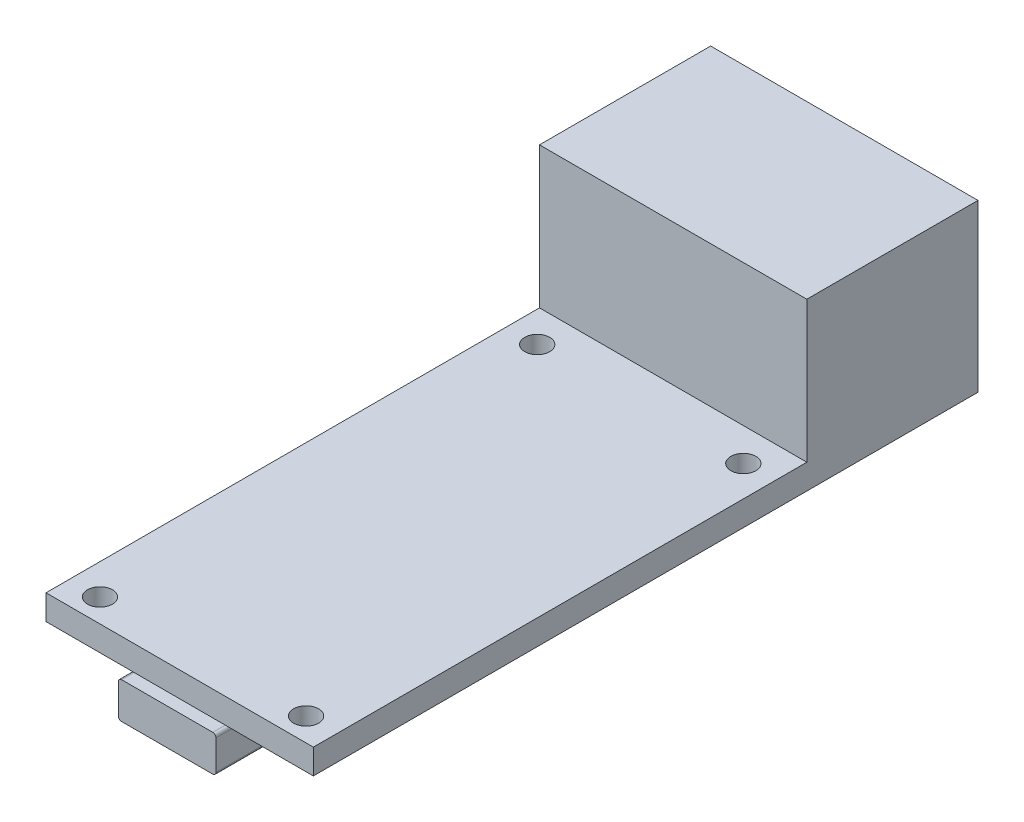
ISO-10303-21;
HEADER;
FILE_DESCRIPTION(('STEP AP214'),'2;1');
FILE_NAME('part.step','',(''),(''),'','','');
FILE_SCHEMA(('AUTOMOTIVE_DESIGN { 1 0 10303 214 1 1 1 1 }'));
ENDSEC;
DATA;
#1=APPLICATION_CONTEXT('core data for automotive mechanical design processes');
#2=APPLICATION_PROTOCOL_DEFINITION('international standard','automotive_design',2000,#1);
#3=PRODUCT_CONTEXT('',#1,'mechanical');
#4=PRODUCT('Part','Part','',(#3));
#5=PRODUCT_RELATED_PRODUCT_CATEGORY('part','',(#4));
#6=PRODUCT_DEFINITION_FORMATION('','',#4);
#7=PRODUCT_DEFINITION_CONTEXT('part definition',#1,'design');
#8=PRODUCT_DEFINITION('design','',#6,#7);
#9=PRODUCT_DEFINITION_SHAPE('','',#8);
#10=(LENGTH_UNIT() NAMED_UNIT(*) SI_UNIT(.MILLI.,.METRE.));
#11=(NAMED_UNIT(*) PLANE_ANGLE_UNIT() SI_UNIT($,.RADIAN.));
#12=(NAMED_UNIT(*) SI_UNIT($,.STERADIAN.) SOLID_ANGLE_UNIT());
#13=UNCERTAINTY_MEASURE_WITH_UNIT(LENGTH_MEASURE(1.E-05),#10,'distance_accuracy_value','');
#14=(GEOMETRIC_REPRESENTATION_CONTEXT(3) GLOBAL_UNCERTAINTY_ASSIGNED_CONTEXT((#13)) GLOBAL_UNIT_ASSIGNED_CONTEXT((#10,
#11,#12)) REPRESENTATION_CONTEXT('',''));
#15=CARTESIAN_POINT('',(0.,0.,0.));
#16=DIRECTION('',(0.,0.,1.));
#17=DIRECTION('',(1.,0.,0.));
#18=AXIS2_PLACEMENT_3D('',#15,#16,#17);
#19=CARTESIAN_POINT('',(0.,2.,0.));
#20=DIRECTION('',(0.,0.,-1.));
#21=DIRECTION('',(-1.,0.,0.));
#22=AXIS2_PLACEMENT_3D('',#19,#20,#21);
#23=PLANE('',#22);
#24=DIRECTION('',(-1.,0.,0.));
#25=VECTOR('',#24,1.);
#26=CARTESIAN_POINT('',(7.05,0.,0.));
#27=LINE('',#26,#25);
#28=CARTESIAN_POINT('',(14.35,0.,0.));
#29=VERTEX_POINT('',#28);
#30=CARTESIAN_POINT('',(7.05,0.,0.));
#31=VERTEX_POINT('',#30);
#32=EDGE_CURVE('E53',#29,#31,#27,.T.);
#33=ORIENTED_EDGE('',*,*,#32,.F.);
#34=DIRECTION('',(1.,0.,0.));
#35=VECTOR('',#34,1.);
#36=CARTESIAN_POINT('',(0.,0.,0.));
#37=LINE('',#36,#35);
#38=CARTESIAN_POINT('',(21.4,0.,0.));
#39=VERTEX_POINT('',#38);
#40=EDGE_CURVE('E273',#29,#39,#37,.T.);
#41=ORIENTED_EDGE('',*,*,#40,.T.);
#42=DIRECTION('',(0.,-1.,0.));
#43=VECTOR('',#42,1.);
#44=CARTESIAN_POINT('',(21.4,2.,0.));
#45=LINE('',#44,#43);
#46=CARTESIAN_POINT('',(21.4,2.,0.));
#47=VERTEX_POINT('',#46);
#48=EDGE_CURVE('E46',#47,#39,#45,.T.);
#49=ORIENTED_EDGE('',*,*,#48,.F.);
#50=DIRECTION('',(1.,0.,0.));
#51=VECTOR('',#50,1.);
#52=CARTESIAN_POINT('',(0.,2.,0.));
#53=LINE('',#52,#51);
#54=CARTESIAN_POINT('',(0.,2.,0.));
#55=VERTEX_POINT('',#54);
#56=EDGE_CURVE('E265',#55,#47,#53,.T.);
#57=ORIENTED_EDGE('',*,*,#56,.F.);
#58=DIRECTION('',(0.,-1.,0.));
#59=VECTOR('',#58,1.);
#60=CARTESIAN_POINT('',(0.,2.,0.));
#61=LINE('',#60,#59);
#62=CARTESIAN_POINT('',(0.,0.,0.));
#63=VERTEX_POINT('',#62);
#64=EDGE_CURVE('E11',#55,#63,#61,.T.);
#65=ORIENTED_EDGE('',*,*,#64,.T.);
#66=EDGE_CURVE('E274',#63,#31,#37,.T.);
#67=ORIENTED_EDGE('',*,*,#66,.T.);
#68=EDGE_LOOP('',(#33,#41,#49,#57,#65,#67));
#69=FACE_BOUND('',#68,.T.);
#70=ADVANCED_FACE('F38',(#69),#23,.F.);
#71=CARTESIAN_POINT('',(0.,2.,0.));
#72=DIRECTION('',(0.,-1.,0.));
#73=DIRECTION('',(0.,0.,-1.));
#74=AXIS2_PLACEMENT_3D('',#71,#72,#73);
#75=PLANE('',#74);
#76=CARTESIAN_POINT('',(2.44999999999999,2.,-36.869115366261));
#77=DIRECTION('',(0.,1.,0.));
#78=DIRECTION('',(0.,0.,1.));
#79=AXIS2_PLACEMENT_3D('',#76,#77,#78);
#80=CIRCLE('',#79,0.999999999999991);
#81=CARTESIAN_POINT('',(2.44999999999999,2.,-35.869115366261));
#82=VERTEX_POINT('',#81);
#83=EDGE_CURVE('E200',#82,#82,#80,.T.);
#84=ORIENTED_EDGE('',*,*,#83,.F.);
#85=EDGE_LOOP('',(#84));
#86=FACE_BOUND('',#85,.T.);
#87=CARTESIAN_POINT('',(18.95,2.,-36.869115366261));
#88=DIRECTION('',(0.,1.,0.));
#89=DIRECTION('',(0.,0.,1.));
#90=AXIS2_PLACEMENT_3D('',#87,#88,#89);
#91=CIRCLE('',#90,0.99999999999999);
#92=CARTESIAN_POINT('',(18.95,2.,-35.869115366261));
#93=VERTEX_POINT('',#92);
#94=EDGE_CURVE('E220',#93,#93,#91,.T.);
#95=ORIENTED_EDGE('',*,*,#94,.F.);
#96=EDGE_LOOP('',(#95));
#97=FACE_BOUND('',#96,.T.);
#98=CARTESIAN_POINT('',(18.95,2.,-1.86911536626101));
#99=DIRECTION('',(0.,1.,0.));
#100=DIRECTION('',(0.,0.,1.));
#101=AXIS2_PLACEMENT_3D('',#98,#99,#100);
#102=CIRCLE('',#101,0.99999999999999);
#103=CARTESIAN_POINT('',(18.95,2.,-0.869115366261017));
#104=VERTEX_POINT('',#103);
#105=EDGE_CURVE('E226',#104,#104,#102,.T.);
#106=ORIENTED_EDGE('',*,*,#105,.F.);
#107=EDGE_LOOP('',(#106));
#108=FACE_BOUND('',#107,.T.);
#109=CARTESIAN_POINT('',(2.44999999999999,2.,-1.86911536626101));
#110=DIRECTION('',(0.,1.,0.));
#111=DIRECTION('',(0.,0.,1.));
#112=AXIS2_PLACEMENT_3D('',#109,#110,#111);
#113=CIRCLE('',#112,0.999999999999991);
#114=CARTESIAN_POINT('',(2.44999999999999,2.,-0.869115366261016));
#115=VERTEX_POINT('',#114);
#116=EDGE_CURVE('E232',#115,#115,#113,.T.);
#117=ORIENTED_EDGE('',*,*,#116,.F.);
#118=EDGE_LOOP('',(#117));
#119=FACE_BOUND('',#118,.T.);
#120=DIRECTION('',(1.,0.,0.));
#121=VECTOR('',#120,1.);
#122=CARTESIAN_POINT('',(0.,2.,-39.5));
#123=LINE('',#122,#121);
#124=CARTESIAN_POINT('',(0.,2.,-39.5));
#125=VERTEX_POINT('',#124);
#126=CARTESIAN_POINT('',(21.4,2.,-39.5));
#127=VERTEX_POINT('',#126);
#128=EDGE_CURVE('E61',#125,#127,#123,.T.);
#129=ORIENTED_EDGE('',*,*,#128,.F.);
#130=DIRECTION('',(0.,0.,1.));
#131=VECTOR('',#130,1.);
#132=CARTESIAN_POINT('',(0.,2.,0.));
#133=LINE('',#132,#131);
#134=EDGE_CURVE('E263',#125,#55,#133,.T.);
#135=ORIENTED_EDGE('',*,*,#134,.T.);
#136=ORIENTED_EDGE('',*,*,#56,.T.);
#137=DIRECTION('',(0.,0.,-1.));
#138=VECTOR('',#137,1.);
#139=CARTESIAN_POINT('',(21.4,2.,0.));
#140=LINE('',#139,#138);
#141=EDGE_CURVE('E268',#47,#127,#140,.T.);
#142=ORIENTED_EDGE('',*,*,#141,.T.);
#143=EDGE_LOOP('',(#129,#135,#136,#142));
#144=FACE_BOUND('',#143,.T.);
#145=ADVANCED_FACE('F320',(#86,#97,#108,#119,#144),#75,.F.);
#146=CARTESIAN_POINT('',(0.,2.,0.));
#147=DIRECTION('',(1.,0.,0.));
#148=DIRECTION('',(0.,0.,-1.));
#149=AXIS2_PLACEMENT_3D('',#146,#147,#148);
#150=PLANE('',#149);
#151=DIRECTION('',(0.,0.,1.));
#152=VECTOR('',#151,1.);
#153=CARTESIAN_POINT('',(0.,0.,0.));
#154=LINE('',#153,#152);
#155=CARTESIAN_POINT('',(0.,0.,-53.2));
#156=VERTEX_POINT('',#155);
#157=EDGE_CURVE('E262',#156,#63,#154,.T.);
#158=ORIENTED_EDGE('',*,*,#157,.T.);
#159=ORIENTED_EDGE('',*,*,#64,.F.);
#160=ORIENTED_EDGE('',*,*,#134,.F.);
#161=DIRECTION('',(0.,-1.,0.));
#162=VECTOR('',#161,1.);
#163=CARTESIAN_POINT('',(0.,13.3,-39.5));
#164=LINE('',#163,#162);
#165=CARTESIAN_POINT('',(0.,13.3,-39.5));
#166=VERTEX_POINT('',#165);
#167=EDGE_CURVE('E259',#166,#125,#164,.T.);
#168=ORIENTED_EDGE('',*,*,#167,.F.);
#169=DIRECTION('',(0.,0.,1.));
#170=VECTOR('',#169,1.);
#171=CARTESIAN_POINT('',(0.,13.3,-53.2));
#172=LINE('',#171,#170);
#173=CARTESIAN_POINT('',(0.,13.3,-53.2));
#174=VERTEX_POINT('',#173);
#175=EDGE_CURVE('E244',#174,#166,#172,.T.);
#176=ORIENTED_EDGE('',*,*,#175,.F.);
#177=DIRECTION('',(0.,-1.,0.));
#178=VECTOR('',#177,1.);
#179=CARTESIAN_POINT('',(0.,2.,-53.2));
#180=LINE('',#179,#178);
#181=EDGE_CURVE('E270',#174,#156,#180,.T.);
#182=ORIENTED_EDGE('',*,*,#181,.T.);
#183=EDGE_LOOP('',(#158,#159,#160,#168,#176,#182));
#184=FACE_BOUND('',#183,.T.);
#185=ADVANCED_FACE('F40',(#184),#150,.F.);
#186=CARTESIAN_POINT('',(21.4,2.,0.));
#187=DIRECTION('',(-1.,0.,0.));
#188=DIRECTION('',(0.,0.,1.));
#189=AXIS2_PLACEMENT_3D('',#186,#187,#188);
#190=PLANE('',#189);
#191=DIRECTION('',(0.,0.,-1.));
#192=VECTOR('',#191,1.);
#193=CARTESIAN_POINT('',(21.4,0.,0.));
#194=LINE('',#193,#192);
#195=CARTESIAN_POINT('',(21.4,0.,-53.2));
#196=VERTEX_POINT('',#195);
#197=EDGE_CURVE('E276',#39,#196,#194,.T.);
#198=ORIENTED_EDGE('',*,*,#197,.T.);
#199=DIRECTION('',(0.,-1.,0.));
#200=VECTOR('',#199,1.);
#201=CARTESIAN_POINT('',(21.4,2.,-53.2));
#202=LINE('',#201,#200);
#203=CARTESIAN_POINT('',(21.4,13.3,-53.2));
#204=VERTEX_POINT('',#203);
#205=EDGE_CURVE('E281',#204,#196,#202,.T.);
#206=ORIENTED_EDGE('',*,*,#205,.F.);
#207=DIRECTION('',(0.,0.,-1.));
#208=VECTOR('',#207,1.);
#209=CARTESIAN_POINT('',(21.4,13.3,-53.2));
#210=LINE('',#209,#208);
#211=CARTESIAN_POINT('',(21.4,13.3,-39.5));
#212=VERTEX_POINT('',#211);
#213=EDGE_CURVE('E249',#212,#204,#210,.T.);
#214=ORIENTED_EDGE('',*,*,#213,.F.);
#215=DIRECTION('',(0.,-1.,0.));
#216=VECTOR('',#215,1.);
#217=CARTESIAN_POINT('',(21.4,13.3,-39.5));
#218=LINE('',#217,#216);
#219=EDGE_CURVE('E255',#212,#127,#218,.T.);
#220=ORIENTED_EDGE('',*,*,#219,.T.);
#221=ORIENTED_EDGE('',*,*,#141,.F.);
#222=ORIENTED_EDGE('',*,*,#48,.T.);
#223=EDGE_LOOP('',(#198,#206,#214,#220,#221,#222));
#224=FACE_BOUND('',#223,.T.);
#225=ADVANCED_FACE('F288',(#224),#190,.F.);
#226=CARTESIAN_POINT('',(0.,2.,-53.2));
#227=DIRECTION('',(0.,0.,1.));
#228=DIRECTION('',(1.,0.,0.));
#229=AXIS2_PLACEMENT_3D('',#226,#227,#228);
#230=PLANE('',#229);
#231=CARTESIAN_POINT('',(10.7,7.65,-53.2));
#232=DIRECTION('',(0.,0.,-1.));
#233=DIRECTION('',(-1.,0.,0.));
#234=AXIS2_PLACEMENT_3D('',#231,#232,#233);
#235=CIRCLE('',#234,3.65);
#236=CARTESIAN_POINT('',(7.04999999999999,7.65,-53.2));
#237=VERTEX_POINT('',#236);
#238=EDGE_CURVE('E238',#237,#237,#235,.T.);
#239=ORIENTED_EDGE('',*,*,#238,.F.);
#240=EDGE_LOOP('',(#239));
#241=FACE_BOUND('',#240,.T.);
#242=DIRECTION('',(-1.,0.,0.));
#243=VECTOR('',#242,1.);
#244=CARTESIAN_POINT('',(0.,0.,-53.2));
#245=LINE('',#244,#243);
#246=EDGE_CURVE('E266',#196,#156,#245,.T.);
#247=ORIENTED_EDGE('',*,*,#246,.T.);
#248=ORIENTED_EDGE('',*,*,#181,.F.);
#249=DIRECTION('',(-1.,0.,0.));
#250=VECTOR('',#249,1.);
#251=CARTESIAN_POINT('',(0.,13.3,-53.2));
#252=LINE('',#251,#250);
#253=EDGE_CURVE('E252',#204,#174,#252,.T.);
#254=ORIENTED_EDGE('',*,*,#253,.F.);
#255=ORIENTED_EDGE('',*,*,#205,.T.);
#256=EDGE_LOOP('',(#247,#248,#254,#255));
#257=FACE_BOUND('',#256,.T.);
#258=ADVANCED_FACE('F296',(#241,#257),#230,.F.);
#259=CARTESIAN_POINT('',(0.,0.,0.));
#260=DIRECTION('',(0.,-1.,0.));
#261=DIRECTION('',(0.,0.,-1.));
#262=AXIS2_PLACEMENT_3D('',#259,#260,#261);
#263=PLANE('',#262);
#264=DIRECTION('',(0.,0.,1.));
#265=VECTOR('',#264,1.);
#266=CARTESIAN_POINT('',(14.35,0.,-5.));
#267=LINE('',#266,#265);
#268=CARTESIAN_POINT('',(14.35,0.,-5.));
#269=VERTEX_POINT('',#268);
#270=EDGE_CURVE('E169',#269,#29,#267,.T.);
#271=ORIENTED_EDGE('',*,*,#270,.F.);
#272=DIRECTION('',(-1.,0.,0.));
#273=VECTOR('',#272,1.);
#274=CARTESIAN_POINT('',(7.05,0.,-5.));
#275=LINE('',#274,#273);
#276=CARTESIAN_POINT('',(7.05,0.,-5.));
#277=VERTEX_POINT('',#276);
#278=EDGE_CURVE('E173',#269,#277,#275,.T.);
#279=ORIENTED_EDGE('',*,*,#278,.T.);
#280=DIRECTION('',(0.,0.,1.));
#281=VECTOR('',#280,1.);
#282=CARTESIAN_POINT('',(7.05,0.,-5.));
#283=LINE('',#282,#281);
#284=EDGE_CURVE('E211',#277,#31,#283,.T.);
#285=ORIENTED_EDGE('',*,*,#284,.T.);
#286=ORIENTED_EDGE('',*,*,#66,.F.);
#287=ORIENTED_EDGE('',*,*,#157,.F.);
#288=ORIENTED_EDGE('',*,*,#246,.F.);
#289=ORIENTED_EDGE('',*,*,#197,.F.);
#290=ORIENTED_EDGE('',*,*,#40,.F.);
#291=EDGE_LOOP('',(#271,#279,#285,#286,#287,#288,#289,#290));
#292=FACE_BOUND('',#291,.T.);
#293=CARTESIAN_POINT('',(2.44999999999999,0.,-36.869115366261));
#294=DIRECTION('',(0.,-1.,0.));
#295=DIRECTION('',(0.,0.,-1.));
#296=AXIS2_PLACEMENT_3D('',#293,#294,#295);
#297=CIRCLE('',#296,0.999999999999995);
#298=CARTESIAN_POINT('',(2.44999999999999,0.,-37.869115366261));
#299=VERTEX_POINT('',#298);
#300=EDGE_CURVE('E217',#299,#299,#297,.T.);
#301=ORIENTED_EDGE('',*,*,#300,.F.);
#302=EDGE_LOOP('',(#301));
#303=FACE_BOUND('',#302,.T.);
#304=CARTESIAN_POINT('',(18.95,0.,-36.869115366261));
#305=DIRECTION('',(0.,-1.,0.));
#306=DIRECTION('',(0.,0.,-1.));
#307=AXIS2_PLACEMENT_3D('',#304,#305,#306);
#308=CIRCLE('',#307,0.999999999999996);
#309=CARTESIAN_POINT('',(18.95,0.,-37.869115366261));
#310=VERTEX_POINT('',#309);
#311=EDGE_CURVE('E223',#310,#310,#308,.T.);
#312=ORIENTED_EDGE('',*,*,#311,.F.);
#313=EDGE_LOOP('',(#312));
#314=FACE_BOUND('',#313,.T.);
#315=CARTESIAN_POINT('',(18.95,0.,-1.86911536626101));
#316=DIRECTION('',(0.,-1.,0.));
#317=DIRECTION('',(0.,0.,-1.));
#318=AXIS2_PLACEMENT_3D('',#315,#316,#317);
#319=CIRCLE('',#318,0.999999999999996);
#320=CARTESIAN_POINT('',(18.95,0.,-2.869115366261));
#321=VERTEX_POINT('',#320);
#322=EDGE_CURVE('E229',#321,#321,#319,.T.);
#323=ORIENTED_EDGE('',*,*,#322,.F.);
#324=EDGE_LOOP('',(#323));
#325=FACE_BOUND('',#324,.T.);
#326=CARTESIAN_POINT('',(2.44999999999999,0.,-1.86911536626101));
#327=DIRECTION('',(0.,-1.,0.));
#328=DIRECTION('',(0.,0.,-1.));
#329=AXIS2_PLACEMENT_3D('',#326,#327,#328);
#330=CIRCLE('',#329,0.999999999999995);
#331=CARTESIAN_POINT('',(2.44999999999999,0.,-2.869115366261));
#332=VERTEX_POINT('',#331);
#333=EDGE_CURVE('E235',#332,#332,#330,.T.);
#334=ORIENTED_EDGE('',*,*,#333,.F.);
#335=EDGE_LOOP('',(#334));
#336=FACE_BOUND('',#335,.T.);
#337=ADVANCED_FACE('F292',(#292,#303,#314,#325,#336),#263,.T.);
#338=CARTESIAN_POINT('',(0.,13.3,-39.5));
#339=DIRECTION('',(0.,0.,-1.));
#340=DIRECTION('',(-1.,0.,0.));
#341=AXIS2_PLACEMENT_3D('',#338,#339,#340);
#342=PLANE('',#341);
#343=ORIENTED_EDGE('',*,*,#128,.T.);
#344=ORIENTED_EDGE('',*,*,#219,.F.);
#345=DIRECTION('',(1.,0.,0.));
#346=VECTOR('',#345,1.);
#347=CARTESIAN_POINT('',(0.,13.3,-39.5));
#348=LINE('',#347,#346);
#349=EDGE_CURVE('E247',#166,#212,#348,.T.);
#350=ORIENTED_EDGE('',*,*,#349,.F.);
#351=ORIENTED_EDGE('',*,*,#167,.T.);
#352=EDGE_LOOP('',(#343,#344,#350,#351));
#353=FACE_BOUND('',#352,.T.);
#354=ADVANCED_FACE('F307',(#353),#342,.F.);
#355=CARTESIAN_POINT('',(0.,13.3,0.));
#356=DIRECTION('',(0.,1.,0.));
#357=DIRECTION('',(0.,0.,1.));
#358=AXIS2_PLACEMENT_3D('',#355,#356,#357);
#359=PLANE('',#358);
#360=ORIENTED_EDGE('',*,*,#175,.T.);
#361=ORIENTED_EDGE('',*,*,#349,.T.);
#362=ORIENTED_EDGE('',*,*,#213,.T.);
#363=ORIENTED_EDGE('',*,*,#253,.T.);
#364=EDGE_LOOP('',(#360,#361,#362,#363));
#365=FACE_BOUND('',#364,.T.);
#366=ADVANCED_FACE('F303',(#365),#359,.T.);
#367=CARTESIAN_POINT('',(10.7,7.65,-49.2));
#368=DIRECTION('',(0.,0.,-1.));
#369=DIRECTION('',(-1.,0.,0.));
#370=AXIS2_PLACEMENT_3D('',#367,#368,#369);
#371=CYLINDRICAL_SURFACE('',#370,3.65);
#372=CARTESIAN_POINT('',(10.7,7.65,-49.2));
#373=DIRECTION('',(0.,0.,-1.));
#374=DIRECTION('',(-1.,0.,0.));
#375=AXIS2_PLACEMENT_3D('',#372,#373,#374);
#376=CIRCLE('',#375,3.65);
#377=CARTESIAN_POINT('',(7.04999999999999,7.65,-49.2));
#378=VERTEX_POINT('',#377);
#379=EDGE_CURVE('E239',#378,#378,#376,.T.);
#380=ORIENTED_EDGE('',*,*,#379,.F.);
#381=EDGE_LOOP('',(#380));
#382=FACE_BOUND('',#381,.T.);
#383=ORIENTED_EDGE('',*,*,#238,.T.);
#384=EDGE_LOOP('',(#383));
#385=FACE_BOUND('',#384,.T.);
#386=ADVANCED_FACE('F314',(#382,#385),#371,.F.);
#387=CARTESIAN_POINT('',(10.7,7.65,-49.2));
#388=DIRECTION('',(0.,0.,-1.));
#389=DIRECTION('',(-1.,0.,0.));
#390=AXIS2_PLACEMENT_3D('',#387,#388,#389);
#391=PLANE('',#390);
#392=ORIENTED_EDGE('',*,*,#379,.T.);
#393=EDGE_LOOP('',(#392));
#394=FACE_BOUND('',#393,.T.);
#395=ADVANCED_FACE('F337',(#394),#391,.T.);
#396=CARTESIAN_POINT('',(2.44999999999999,2.,-1.86911536626101));
#397=DIRECTION('',(0.,1.,0.));
#398=DIRECTION('',(0.,0.,1.));
#399=AXIS2_PLACEMENT_3D('',#396,#397,#398);
#400=CYLINDRICAL_SURFACE('',#399,0.999999999999995);
#401=ORIENTED_EDGE('',*,*,#116,.T.);
#402=EDGE_LOOP('',(#401));
#403=FACE_BOUND('',#402,.T.);
#404=ORIENTED_EDGE('',*,*,#333,.T.);
#405=EDGE_LOOP('',(#404));
#406=FACE_BOUND('',#405,.T.);
#407=ADVANCED_FACE('F343',(#403,#406),#400,.F.);
#408=CARTESIAN_POINT('',(18.95,2.,-1.86911536626101));
#409=DIRECTION('',(0.,1.,0.));
#410=DIRECTION('',(0.,0.,1.));
#411=AXIS2_PLACEMENT_3D('',#408,#409,#410);
#412=CYLINDRICAL_SURFACE('',#411,0.999999999999996);
#413=ORIENTED_EDGE('',*,*,#105,.T.);
#414=EDGE_LOOP('',(#413));
#415=FACE_BOUND('',#414,.T.);
#416=ORIENTED_EDGE('',*,*,#322,.T.);
#417=EDGE_LOOP('',(#416));
#418=FACE_BOUND('',#417,.T.);
#419=ADVANCED_FACE('F350',(#415,#418),#412,.F.);
#420=CARTESIAN_POINT('',(18.95,2.,-36.869115366261));
#421=DIRECTION('',(0.,1.,0.));
#422=DIRECTION('',(0.,0.,1.));
#423=AXIS2_PLACEMENT_3D('',#420,#421,#422);
#424=CYLINDRICAL_SURFACE('',#423,0.999999999999996);
#425=ORIENTED_EDGE('',*,*,#94,.T.);
#426=EDGE_LOOP('',(#425));
#427=FACE_BOUND('',#426,.T.);
#428=ORIENTED_EDGE('',*,*,#311,.T.);
#429=EDGE_LOOP('',(#428));
#430=FACE_BOUND('',#429,.T.);
#431=ADVANCED_FACE('F354',(#427,#430),#424,.F.);
#432=CARTESIAN_POINT('',(2.44999999999999,2.,-36.869115366261));
#433=DIRECTION('',(0.,1.,0.));
#434=DIRECTION('',(0.,0.,1.));
#435=AXIS2_PLACEMENT_3D('',#432,#433,#434);
#436=CYLINDRICAL_SURFACE('',#435,0.999999999999995);
#437=ORIENTED_EDGE('',*,*,#83,.T.);
#438=EDGE_LOOP('',(#437));
#439=FACE_BOUND('',#438,.T.);
#440=ORIENTED_EDGE('',*,*,#300,.T.);
#441=EDGE_LOOP('',(#440));
#442=FACE_BOUND('',#441,.T.);
#443=ADVANCED_FACE('F358',(#439,#442),#436,.F.);
#444=CARTESIAN_POINT('',(14.35,-0.249999999999993,-5.));
#445=DIRECTION('',(0.,0.,1.));
#446=DIRECTION('',(1.,0.,0.));
#447=AXIS2_PLACEMENT_3D('',#444,#445,#446);
#448=CYLINDRICAL_SURFACE('',#447,0.25);
#449=ORIENTED_EDGE('',*,*,#270,.T.);
#450=DIRECTION('',(0.,0.,-1.));
#451=VECTOR('',#450,1.);
#452=CARTESIAN_POINT('',(14.35,0.,1.));
#453=LINE('',#452,#451);
#454=CARTESIAN_POINT('',(14.35,0.,1.));
#455=VERTEX_POINT('',#454);
#456=EDGE_CURVE('E149',#455,#29,#453,.T.);
#457=ORIENTED_EDGE('',*,*,#456,.F.);
#458=CARTESIAN_POINT('',(14.35,-0.249999999999993,1.));
#459=DIRECTION('',(0.,0.,1.));
#460=DIRECTION('',(-1.,0.,0.));
#461=AXIS2_PLACEMENT_3D('',#458,#459,#460);
#462=CIRCLE('',#461,0.25);
#463=CARTESIAN_POINT('',(14.6,-0.249999999999995,1.));
#464=VERTEX_POINT('',#463);
#465=EDGE_CURVE('E156',#464,#455,#462,.T.);
#466=ORIENTED_EDGE('',*,*,#465,.F.);
#467=DIRECTION('',(0.,0.,1.));
#468=VECTOR('',#467,1.);
#469=CARTESIAN_POINT('',(14.6,-0.249999999999995,-5.));
#470=LINE('',#469,#468);
#471=CARTESIAN_POINT('',(14.6,-0.249999999999995,-5.));
#472=VERTEX_POINT('',#471);
#473=EDGE_CURVE('E198',#472,#464,#470,.T.);
#474=ORIENTED_EDGE('',*,*,#473,.F.);
#475=CARTESIAN_POINT('',(14.35,-0.249999999999993,-5.));
#476=DIRECTION('',(0.,0.,1.));
#477=DIRECTION('',(-1.,0.,0.));
#478=AXIS2_PLACEMENT_3D('',#475,#476,#477);
#479=CIRCLE('',#478,0.25);
#480=EDGE_CURVE('E171',#472,#269,#479,.T.);
#481=ORIENTED_EDGE('',*,*,#480,.T.);
#482=EDGE_LOOP('',(#449,#457,#466,#474,#481));
#483=FACE_BOUND('',#482,.T.);
#484=ADVANCED_FACE('F166',(#483),#448,.T.);
#485=CARTESIAN_POINT('',(14.6,-0.249999999999995,-5.));
#486=DIRECTION('',(1.,0.,0.));
#487=DIRECTION('',(0.,1.,0.));
#488=AXIS2_PLACEMENT_3D('',#485,#486,#487);
#489=PLANE('',#488);
#490=ORIENTED_EDGE('',*,*,#473,.T.);
#491=DIRECTION('',(0.,1.,0.));
#492=VECTOR('',#491,1.);
#493=CARTESIAN_POINT('',(14.6,-0.249999999999995,1.));
#494=LINE('',#493,#492);
#495=CARTESIAN_POINT('',(14.6,-2.64999999999999,1.));
#496=VERTEX_POINT('',#495);
#497=EDGE_CURVE('E163',#496,#464,#494,.T.);
#498=ORIENTED_EDGE('',*,*,#497,.F.);
#499=DIRECTION('',(0.,0.,1.));
#500=VECTOR('',#499,1.);
#501=CARTESIAN_POINT('',(14.6,-2.64999999999999,-5.));
#502=LINE('',#501,#500);
#503=CARTESIAN_POINT('',(14.6,-2.64999999999999,-5.));
#504=VERTEX_POINT('',#503);
#505=EDGE_CURVE('E201',#504,#496,#502,.T.);
#506=ORIENTED_EDGE('',*,*,#505,.F.);
#507=DIRECTION('',(0.,1.,0.));
#508=VECTOR('',#507,1.);
#509=CARTESIAN_POINT('',(14.6,-0.249999999999995,-5.));
#510=LINE('',#509,#508);
#511=EDGE_CURVE('E195',#504,#472,#510,.T.);
#512=ORIENTED_EDGE('',*,*,#511,.T.);
#513=EDGE_LOOP('',(#490,#498,#506,#512));
#514=FACE_BOUND('',#513,.T.);
#515=ADVANCED_FACE('F363',(#514),#489,.T.);
#516=CARTESIAN_POINT('',(14.35,-2.64999999999999,-5.));
#517=DIRECTION('',(0.,0.,1.));
#518=DIRECTION('',(1.,0.,0.));
#519=AXIS2_PLACEMENT_3D('',#516,#517,#518);
#520=CYLINDRICAL_SURFACE('',#519,0.25);
#521=ORIENTED_EDGE('',*,*,#505,.T.);
#522=CARTESIAN_POINT('',(14.35,-2.64999999999999,1.));
#523=DIRECTION('',(0.,0.,1.));
#524=DIRECTION('',(1.,0.,0.));
#525=AXIS2_PLACEMENT_3D('',#522,#523,#524);
#526=CIRCLE('',#525,0.25);
#527=CARTESIAN_POINT('',(14.35,-2.89999999999999,1.));
#528=VERTEX_POINT('',#527);
#529=EDGE_CURVE('E580',#528,#496,#526,.T.);
#530=ORIENTED_EDGE('',*,*,#529,.F.);
#531=DIRECTION('',(0.,0.,1.));
#532=VECTOR('',#531,1.);
#533=CARTESIAN_POINT('',(14.35,-2.89999999999999,-5.));
#534=LINE('',#533,#532);
#535=CARTESIAN_POINT('',(14.35,-2.89999999999999,-5.));
#536=VERTEX_POINT('',#535);
#537=EDGE_CURVE('E203',#536,#528,#534,.T.);
#538=ORIENTED_EDGE('',*,*,#537,.F.);
#539=CARTESIAN_POINT('',(14.35,-2.64999999999999,-5.));
#540=DIRECTION('',(0.,0.,1.));
#541=DIRECTION('',(1.,0.,0.));
#542=AXIS2_PLACEMENT_3D('',#539,#540,#541);
#543=CIRCLE('',#542,0.25);
#544=EDGE_CURVE('E192',#536,#504,#543,.T.);
#545=ORIENTED_EDGE('',*,*,#544,.T.);
#546=EDGE_LOOP('',(#521,#530,#538,#545));
#547=FACE_BOUND('',#546,.T.);
#548=ADVANCED_FACE('F380',(#547),#520,.T.);
#549=CARTESIAN_POINT('',(7.05,-2.89999999999999,-5.));
#550=DIRECTION('',(0.,-1.,0.));
#551=DIRECTION('',(1.,0.,0.));
#552=AXIS2_PLACEMENT_3D('',#549,#550,#551);
#553=PLANE('',#552);
#554=ORIENTED_EDGE('',*,*,#537,.T.);
#555=DIRECTION('',(1.,0.,0.));
#556=VECTOR('',#555,1.);
#557=CARTESIAN_POINT('',(7.05,-2.89999999999999,1.));
#558=LINE('',#557,#556);
#559=CARTESIAN_POINT('',(7.05,-2.89999999999999,1.));
#560=VERTEX_POINT('',#559);
#561=EDGE_CURVE('E572',#560,#528,#558,.T.);
#562=ORIENTED_EDGE('',*,*,#561,.F.);
#563=DIRECTION('',(0.,0.,1.));
#564=VECTOR('',#563,1.);
#565=CARTESIAN_POINT('',(7.05,-2.89999999999999,-5.));
#566=LINE('',#565,#564);
#567=CARTESIAN_POINT('',(7.05,-2.89999999999999,-5.));
#568=VERTEX_POINT('',#567);
#569=EDGE_CURVE('E205',#568,#560,#566,.T.);
#570=ORIENTED_EDGE('',*,*,#569,.F.);
#571=DIRECTION('',(1.,0.,0.));
#572=VECTOR('',#571,1.);
#573=CARTESIAN_POINT('',(7.05,-2.89999999999999,-5.));
#574=LINE('',#573,#572);
#575=EDGE_CURVE('E189',#568,#536,#574,.T.);
#576=ORIENTED_EDGE('',*,*,#575,.T.);
#577=EDGE_LOOP('',(#554,#562,#570,#576));
#578=FACE_BOUND('',#577,.T.);
#579=ADVANCED_FACE('F376',(#578),#553,.T.);
#580=CARTESIAN_POINT('',(7.05,-2.64999999999999,-5.));
#581=DIRECTION('',(0.,0.,1.));
#582=DIRECTION('',(1.,0.,0.));
#583=AXIS2_PLACEMENT_3D('',#580,#581,#582);
#584=CYLINDRICAL_SURFACE('',#583,0.25);
#585=ORIENTED_EDGE('',*,*,#569,.T.);
#586=CARTESIAN_POINT('',(7.05,-2.64999999999999,1.));
#587=DIRECTION('',(0.,0.,1.));
#588=DIRECTION('',(1.,0.,0.));
#589=AXIS2_PLACEMENT_3D('',#586,#587,#588);
#590=CIRCLE('',#589,0.25);
#591=CARTESIAN_POINT('',(6.8,-2.64999999999999,1.));
#592=VERTEX_POINT('',#591);
#593=EDGE_CURVE('E575',#592,#560,#590,.T.);
#594=ORIENTED_EDGE('',*,*,#593,.F.);
#595=DIRECTION('',(0.,0.,1.));
#596=VECTOR('',#595,1.);
#597=CARTESIAN_POINT('',(6.8,-2.64999999999999,-5.));
#598=LINE('',#597,#596);
#599=CARTESIAN_POINT('',(6.8,-2.64999999999999,-5.));
#600=VERTEX_POINT('',#599);
#601=EDGE_CURVE('E207',#600,#592,#598,.T.);
#602=ORIENTED_EDGE('',*,*,#601,.F.);
#603=CARTESIAN_POINT('',(7.05,-2.64999999999999,-5.));
#604=DIRECTION('',(0.,0.,1.));
#605=DIRECTION('',(1.,0.,0.));
#606=AXIS2_PLACEMENT_3D('',#603,#604,#605);
#607=CIRCLE('',#606,0.25);
#608=EDGE_CURVE('E186',#600,#568,#607,.T.);
#609=ORIENTED_EDGE('',*,*,#608,.T.);
#610=EDGE_LOOP('',(#585,#594,#602,#609));
#611=FACE_BOUND('',#610,.T.);
#612=ADVANCED_FACE('F372',(#611),#584,.T.);
#613=CARTESIAN_POINT('',(6.8,-0.25,-5.));
#614=DIRECTION('',(-1.,0.,0.));
#615=DIRECTION('',(0.,-1.,0.));
#616=AXIS2_PLACEMENT_3D('',#613,#614,#615);
#617=PLANE('',#616);
#618=ORIENTED_EDGE('',*,*,#601,.T.);
#619=DIRECTION('',(0.,-1.,0.));
#620=VECTOR('',#619,1.);
#621=CARTESIAN_POINT('',(6.8,-0.25,1.));
#622=LINE('',#621,#620);
#623=CARTESIAN_POINT('',(6.8,-0.25,1.));
#624=VERTEX_POINT('',#623);
#625=EDGE_CURVE('E578',#624,#592,#622,.T.);
#626=ORIENTED_EDGE('',*,*,#625,.F.);
#627=DIRECTION('',(0.,0.,1.));
#628=VECTOR('',#627,1.);
#629=CARTESIAN_POINT('',(6.8,-0.25,-5.));
#630=LINE('',#629,#628);
#631=CARTESIAN_POINT('',(6.8,-0.25,-5.));
#632=VERTEX_POINT('',#631);
#633=EDGE_CURVE('E209',#632,#624,#630,.T.);
#634=ORIENTED_EDGE('',*,*,#633,.F.);
#635=DIRECTION('',(0.,-1.,0.));
#636=VECTOR('',#635,1.);
#637=CARTESIAN_POINT('',(6.8,-0.25,-5.));
#638=LINE('',#637,#636);
#639=EDGE_CURVE('E183',#632,#600,#638,.T.);
#640=ORIENTED_EDGE('',*,*,#639,.T.);
#641=EDGE_LOOP('',(#618,#626,#634,#640));
#642=FACE_BOUND('',#641,.T.);
#643=ADVANCED_FACE('F368',(#642),#617,.T.);
#644=CARTESIAN_POINT('',(7.05,-0.249999999999998,-5.));
#645=DIRECTION('',(0.,0.,1.));
#646=DIRECTION('',(1.,0.,0.));
#647=AXIS2_PLACEMENT_3D('',#644,#645,#646);
#648=CYLINDRICAL_SURFACE('',#647,0.25);
#649=ORIENTED_EDGE('',*,*,#633,.T.);
#650=CARTESIAN_POINT('',(7.05,-0.249999999999998,1.));
#651=DIRECTION('',(0.,0.,1.));
#652=DIRECTION('',(1.,0.,0.));
#653=AXIS2_PLACEMENT_3D('',#650,#651,#652);
#654=CIRCLE('',#653,0.25);
#655=CARTESIAN_POINT('',(7.05,0.,1.));
#656=VERTEX_POINT('',#655);
#657=EDGE_CURVE('E155',#656,#624,#654,.T.);
#658=ORIENTED_EDGE('',*,*,#657,.F.);
#659=DIRECTION('',(0.,0.,-1.));
#660=VECTOR('',#659,1.);
#661=CARTESIAN_POINT('',(7.05,0.,1.));
#662=LINE('',#661,#660);
#663=EDGE_CURVE('E151',#656,#31,#662,.T.);
#664=ORIENTED_EDGE('',*,*,#663,.T.);
#665=ORIENTED_EDGE('',*,*,#284,.F.);
#666=CARTESIAN_POINT('',(7.05,-0.249999999999998,-5.));
#667=DIRECTION('',(0.,0.,1.));
#668=DIRECTION('',(1.,0.,0.));
#669=AXIS2_PLACEMENT_3D('',#666,#667,#668);
#670=CIRCLE('',#669,0.25);
#671=EDGE_CURVE('E180',#277,#632,#670,.T.);
#672=ORIENTED_EDGE('',*,*,#671,.T.);
#673=EDGE_LOOP('',(#649,#658,#664,#665,#672));
#674=FACE_BOUND('',#673,.T.);
#675=ADVANCED_FACE('F364',(#674),#648,.T.);
#676=CARTESIAN_POINT('',(14.35,-0.249999999999993,-5.));
#677=DIRECTION('',(0.,0.,-1.));
#678=DIRECTION('',(-1.,0.,0.));
#679=AXIS2_PLACEMENT_3D('',#676,#677,#678);
#680=PLANE('',#679);
#681=ORIENTED_EDGE('',*,*,#480,.F.);
#682=ORIENTED_EDGE('',*,*,#511,.F.);
#683=ORIENTED_EDGE('',*,*,#544,.F.);
#684=ORIENTED_EDGE('',*,*,#575,.F.);
#685=ORIENTED_EDGE('',*,*,#608,.F.);
#686=ORIENTED_EDGE('',*,*,#639,.F.);
#687=ORIENTED_EDGE('',*,*,#671,.F.);
#688=ORIENTED_EDGE('',*,*,#278,.F.);
#689=EDGE_LOOP('',(#681,#682,#683,#684,#685,#686,#687,#688));
#690=FACE_BOUND('',#689,.T.);
#691=ADVANCED_FACE('F367',(#690),#680,.T.);
#692=CARTESIAN_POINT('',(7.05,0.,1.));
#693=DIRECTION('',(0.,-1.,0.));
#694=DIRECTION('',(1.,0.,0.));
#695=AXIS2_PLACEMENT_3D('',#692,#693,#694);
#696=PLANE('',#695);
#697=ORIENTED_EDGE('',*,*,#32,.T.);
#698=ORIENTED_EDGE('',*,*,#663,.F.);
#699=DIRECTION('',(-1.,0.,0.));
#700=VECTOR('',#699,1.);
#701=CARTESIAN_POINT('',(7.05,0.,1.));
#702=LINE('',#701,#700);
#703=EDGE_CURVE('E145',#455,#656,#702,.T.);
#704=ORIENTED_EDGE('',*,*,#703,.F.);
#705=ORIENTED_EDGE('',*,*,#456,.T.);
#706=EDGE_LOOP('',(#697,#698,#704,#705));
#707=FACE_BOUND('',#706,.T.);
#708=ADVANCED_FACE('F147',(#707),#696,.F.);
#709=CARTESIAN_POINT('',(14.35,-0.249999999999993,1.));
#710=DIRECTION('',(0.,0.,-1.));
#711=DIRECTION('',(-1.,0.,0.));
#712=AXIS2_PLACEMENT_3D('',#709,#710,#711);
#713=PLANE('',#712);
#714=ORIENTED_EDGE('',*,*,#465,.T.);
#715=ORIENTED_EDGE('',*,*,#703,.T.);
#716=ORIENTED_EDGE('',*,*,#657,.T.);
#717=ORIENTED_EDGE('',*,*,#625,.T.);
#718=ORIENTED_EDGE('',*,*,#593,.T.);
#719=ORIENTED_EDGE('',*,*,#561,.T.);
#720=ORIENTED_EDGE('',*,*,#529,.T.);
#721=ORIENTED_EDGE('',*,*,#497,.T.);
#722=EDGE_LOOP('',(#714,#715,#716,#717,#718,#719,#720,#721));
#723=FACE_BOUND('',#722,.T.);
#724=ADVANCED_FACE('F160',(#723),#713,.F.);
#725=CLOSED_SHELL('',(#70,#145,#185,#225,#258,#337,#354,#366,#386,#395,#407,#419,#431,#443,#484,
#515,#548,#579,#612,#643,#675,#691,#708,#724));
#726=MANIFOLD_SOLID_BREP('B2',#725);
#727=ADVANCED_BREP_SHAPE_REPRESENTATION('',(#18,#726),#14);
#728=SHAPE_DEFINITION_REPRESENTATION(#9,#727);
ENDSEC;
END-ISO-10303-21;
